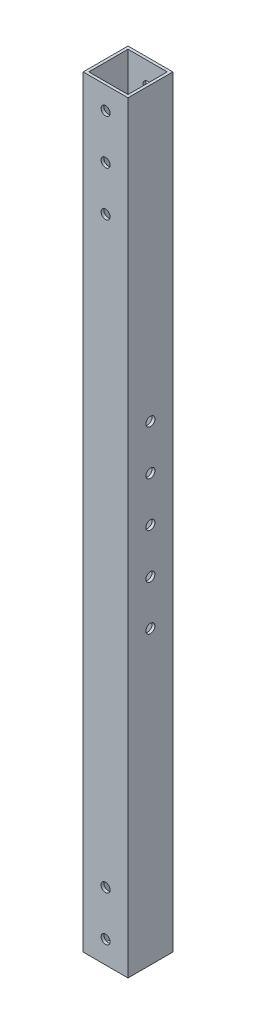
ISO-10303-21;
HEADER;
FILE_DESCRIPTION(('STEP AP214'),'2;1');
FILE_NAME('part.step','',(''),(''),'','','');
FILE_SCHEMA(('AUTOMOTIVE_DESIGN { 1 0 10303 214 1 1 1 1 }'));
ENDSEC;
DATA;
#1=APPLICATION_CONTEXT('core data for automotive mechanical design processes');
#2=APPLICATION_PROTOCOL_DEFINITION('international standard','automotive_design',2000,#1);
#3=PRODUCT_CONTEXT('',#1,'mechanical');
#4=PRODUCT('Part','Part','',(#3));
#5=PRODUCT_RELATED_PRODUCT_CATEGORY('part','',(#4));
#6=PRODUCT_DEFINITION_FORMATION('','',#4);
#7=PRODUCT_DEFINITION_CONTEXT('part definition',#1,'design');
#8=PRODUCT_DEFINITION('design','',#6,#7);
#9=PRODUCT_DEFINITION_SHAPE('','',#8);
#10=(LENGTH_UNIT() NAMED_UNIT(*) SI_UNIT(.MILLI.,.METRE.));
#11=(NAMED_UNIT(*) PLANE_ANGLE_UNIT() SI_UNIT($,.RADIAN.));
#12=(NAMED_UNIT(*) SI_UNIT($,.STERADIAN.) SOLID_ANGLE_UNIT());
#13=UNCERTAINTY_MEASURE_WITH_UNIT(LENGTH_MEASURE(1.E-05),#10,'distance_accuracy_value','');
#14=(GEOMETRIC_REPRESENTATION_CONTEXT(3) GLOBAL_UNCERTAINTY_ASSIGNED_CONTEXT((#13)) GLOBAL_UNIT_ASSIGNED_CONTEXT((#10,
#11,#12)) REPRESENTATION_CONTEXT('',''));
#15=CARTESIAN_POINT('',(0.,0.,0.));
#16=DIRECTION('',(0.,0.,1.));
#17=DIRECTION('',(1.,0.,0.));
#18=AXIS2_PLACEMENT_3D('',#15,#16,#17);
#19=CARTESIAN_POINT('',(0.,431.8,0.));
#20=DIRECTION('',(0.,-1.,0.));
#21=DIRECTION('',(0.,0.,-1.));
#22=AXIS2_PLACEMENT_3D('',#19,#20,#21);
#23=PLANE('',#22);
#24=DIRECTION('',(0.,0.,-1.));
#25=VECTOR('',#24,1.);
#26=CARTESIAN_POINT('',(12.7,431.8,12.7));
#27=LINE('',#26,#25);
#28=CARTESIAN_POINT('',(12.7,431.8,12.7));
#29=VERTEX_POINT('',#28);
#30=CARTESIAN_POINT('',(12.7,431.8,-12.7));
#31=VERTEX_POINT('',#30);
#32=EDGE_CURVE('E142',#29,#31,#27,.T.);
#33=ORIENTED_EDGE('',*,*,#32,.T.);
#34=DIRECTION('',(-1.,0.,0.));
#35=VECTOR('',#34,1.);
#36=CARTESIAN_POINT('',(-12.7,431.8,-12.7));
#37=LINE('',#36,#35);
#38=CARTESIAN_POINT('',(-12.7,431.8,-12.7));
#39=VERTEX_POINT('',#38);
#40=EDGE_CURVE('E145',#31,#39,#37,.T.);
#41=ORIENTED_EDGE('',*,*,#40,.T.);
#42=DIRECTION('',(0.,0.,1.));
#43=VECTOR('',#42,1.);
#44=CARTESIAN_POINT('',(-12.7,431.8,12.7));
#45=LINE('',#44,#43);
#46=CARTESIAN_POINT('',(-12.7,431.8,12.7));
#47=VERTEX_POINT('',#46);
#48=EDGE_CURVE('E148',#39,#47,#45,.T.);
#49=ORIENTED_EDGE('',*,*,#48,.T.);
#50=DIRECTION('',(1.,0.,0.));
#51=VECTOR('',#50,1.);
#52=CARTESIAN_POINT('',(-12.7,431.8,12.7));
#53=LINE('',#52,#51);
#54=EDGE_CURVE('E150',#47,#29,#53,.T.);
#55=ORIENTED_EDGE('',*,*,#54,.T.);
#56=EDGE_LOOP('',(#33,#41,#49,#55));
#57=FACE_BOUND('',#56,.T.);
#58=DIRECTION('',(0.,0.,-1.));
#59=VECTOR('',#58,1.);
#60=CARTESIAN_POINT('',(11.1125,431.8,11.1125));
#61=LINE('',#60,#59);
#62=CARTESIAN_POINT('',(11.1125,431.8,11.1125));
#63=VERTEX_POINT('',#62);
#64=CARTESIAN_POINT('',(11.1125,431.8,-11.1125));
#65=VERTEX_POINT('',#64);
#66=EDGE_CURVE('E104',#63,#65,#61,.T.);
#67=ORIENTED_EDGE('',*,*,#66,.F.);
#68=DIRECTION('',(1.,0.,0.));
#69=VECTOR('',#68,1.);
#70=CARTESIAN_POINT('',(-11.1125,431.8,11.1125));
#71=LINE('',#70,#69);
#72=CARTESIAN_POINT('',(-11.1125,431.8,11.1125));
#73=VERTEX_POINT('',#72);
#74=EDGE_CURVE('E126',#73,#63,#71,.T.);
#75=ORIENTED_EDGE('',*,*,#74,.F.);
#76=DIRECTION('',(0.,0.,1.));
#77=VECTOR('',#76,1.);
#78=CARTESIAN_POINT('',(-11.1125,431.8,11.1125));
#79=LINE('',#78,#77);
#80=CARTESIAN_POINT('',(-11.1125,431.8,-11.1125));
#81=VERTEX_POINT('',#80);
#82=EDGE_CURVE('E124',#81,#73,#79,.T.);
#83=ORIENTED_EDGE('',*,*,#82,.F.);
#84=DIRECTION('',(-1.,0.,0.));
#85=VECTOR('',#84,1.);
#86=CARTESIAN_POINT('',(-11.1125,431.8,-11.1125));
#87=LINE('',#86,#85);
#88=EDGE_CURVE('E112',#65,#81,#87,.T.);
#89=ORIENTED_EDGE('',*,*,#88,.F.);
#90=EDGE_LOOP('',(#67,#75,#83,#89));
#91=FACE_BOUND('',#90,.T.);
#92=ADVANCED_FACE('F37',(#57,#91),#23,.F.);
#93=CARTESIAN_POINT('',(0.,0.,0.));
#94=DIRECTION('',(0.,-1.,0.));
#95=DIRECTION('',(0.,0.,-1.));
#96=AXIS2_PLACEMENT_3D('',#93,#94,#95);
#97=PLANE('',#96);
#98=DIRECTION('',(0.,0.,-1.));
#99=VECTOR('',#98,1.);
#100=CARTESIAN_POINT('',(12.7,0.,12.7));
#101=LINE('',#100,#99);
#102=CARTESIAN_POINT('',(12.7,0.,12.7));
#103=VERTEX_POINT('',#102);
#104=CARTESIAN_POINT('',(12.7,0.,-12.7));
#105=VERTEX_POINT('',#104);
#106=EDGE_CURVE('E120',#103,#105,#101,.T.);
#107=ORIENTED_EDGE('',*,*,#106,.F.);
#108=DIRECTION('',(1.,0.,0.));
#109=VECTOR('',#108,1.);
#110=CARTESIAN_POINT('',(-12.7,0.,12.7));
#111=LINE('',#110,#109);
#112=CARTESIAN_POINT('',(-12.7,0.,12.7));
#113=VERTEX_POINT('',#112);
#114=EDGE_CURVE('E146',#113,#103,#111,.T.);
#115=ORIENTED_EDGE('',*,*,#114,.F.);
#116=DIRECTION('',(0.,0.,1.));
#117=VECTOR('',#116,1.);
#118=CARTESIAN_POINT('',(-12.7,0.,12.7));
#119=LINE('',#118,#117);
#120=CARTESIAN_POINT('',(-12.7,0.,-12.7));
#121=VERTEX_POINT('',#120);
#122=EDGE_CURVE('E157',#121,#113,#119,.T.);
#123=ORIENTED_EDGE('',*,*,#122,.F.);
#124=DIRECTION('',(-1.,0.,0.));
#125=VECTOR('',#124,1.);
#126=CARTESIAN_POINT('',(-12.7,0.,-12.7));
#127=LINE('',#126,#125);
#128=EDGE_CURVE('E155',#105,#121,#127,.T.);
#129=ORIENTED_EDGE('',*,*,#128,.F.);
#130=EDGE_LOOP('',(#107,#115,#123,#129));
#131=FACE_BOUND('',#130,.T.);
#132=DIRECTION('',(1.,0.,0.));
#133=VECTOR('',#132,1.);
#134=CARTESIAN_POINT('',(-11.1125,0.,11.1125));
#135=LINE('',#134,#133);
#136=CARTESIAN_POINT('',(-11.1125,0.,11.1125));
#137=VERTEX_POINT('',#136);
#138=CARTESIAN_POINT('',(11.1125,0.,11.1125));
#139=VERTEX_POINT('',#138);
#140=EDGE_CURVE('E113',#137,#139,#135,.T.);
#141=ORIENTED_EDGE('',*,*,#140,.T.);
#142=DIRECTION('',(0.,0.,-1.));
#143=VECTOR('',#142,1.);
#144=CARTESIAN_POINT('',(11.1125,0.,11.1125));
#145=LINE('',#144,#143);
#146=CARTESIAN_POINT('',(11.1125,0.,-11.1125));
#147=VERTEX_POINT('',#146);
#148=EDGE_CURVE('E62',#139,#147,#145,.T.);
#149=ORIENTED_EDGE('',*,*,#148,.T.);
#150=DIRECTION('',(-1.,0.,0.));
#151=VECTOR('',#150,1.);
#152=CARTESIAN_POINT('',(-11.1125,0.,-11.1125));
#153=LINE('',#152,#151);
#154=CARTESIAN_POINT('',(-11.1125,0.,-11.1125));
#155=VERTEX_POINT('',#154);
#156=EDGE_CURVE('E119',#147,#155,#153,.T.);
#157=ORIENTED_EDGE('',*,*,#156,.T.);
#158=DIRECTION('',(0.,0.,1.));
#159=VECTOR('',#158,1.);
#160=CARTESIAN_POINT('',(-11.1125,0.,11.1125));
#161=LINE('',#160,#159);
#162=EDGE_CURVE('E134',#155,#137,#161,.T.);
#163=ORIENTED_EDGE('',*,*,#162,.T.);
#164=EDGE_LOOP('',(#141,#149,#157,#163));
#165=FACE_BOUND('',#164,.T.);
#166=ADVANCED_FACE('F301',(#131,#165),#97,.T.);
#167=CARTESIAN_POINT('',(12.7,431.8,12.7));
#168=DIRECTION('',(-1.,0.,0.));
#169=DIRECTION('',(0.,0.,1.));
#170=AXIS2_PLACEMENT_3D('',#167,#168,#169);
#171=PLANE('',#170);
#172=CARTESIAN_POINT('',(12.7,165.1,5.22769947430191E-13));
#173=DIRECTION('',(1.,0.,0.));
#174=DIRECTION('',(0.,0.,-1.));
#175=AXIS2_PLACEMENT_3D('',#172,#173,#174);
#176=CIRCLE('',#175,2.55269999999999);
#177=CARTESIAN_POINT('',(12.7,165.1,-2.55269999999947));
#178=VERTEX_POINT('',#177);
#179=EDGE_CURVE('E413',#178,#178,#176,.T.);
#180=ORIENTED_EDGE('',*,*,#179,.F.);
#181=EDGE_LOOP('',(#180));
#182=FACE_BOUND('',#181,.T.);
#183=CARTESIAN_POINT('',(12.7,190.5,6.09898272001889E-13));
#184=DIRECTION('',(1.,0.,0.));
#185=DIRECTION('',(0.,0.,-1.));
#186=AXIS2_PLACEMENT_3D('',#183,#184,#185);
#187=CIRCLE('',#186,2.55269999999999);
#188=CARTESIAN_POINT('',(12.7,190.5,-2.55269999999938));
#189=VERTEX_POINT('',#188);
#190=EDGE_CURVE('E191',#189,#189,#187,.T.);
#191=ORIENTED_EDGE('',*,*,#190,.F.);
#192=EDGE_LOOP('',(#191));
#193=FACE_BOUND('',#192,.T.);
#194=CARTESIAN_POINT('',(12.7,215.9,6.97026596573588E-13));
#195=DIRECTION('',(1.,0.,0.));
#196=DIRECTION('',(0.,0.,-1.));
#197=AXIS2_PLACEMENT_3D('',#194,#195,#196);
#198=CIRCLE('',#197,2.55269999999999);
#199=CARTESIAN_POINT('',(12.7,215.9,-2.55269999999929));
#200=VERTEX_POINT('',#199);
#201=EDGE_CURVE('E188',#200,#200,#198,.T.);
#202=ORIENTED_EDGE('',*,*,#201,.F.);
#203=EDGE_LOOP('',(#202));
#204=FACE_BOUND('',#203,.T.);
#205=CARTESIAN_POINT('',(12.7,241.3,7.84154921145286E-13));
#206=DIRECTION('',(1.,0.,0.));
#207=DIRECTION('',(0.,0.,-1.));
#208=AXIS2_PLACEMENT_3D('',#205,#206,#207);
#209=CIRCLE('',#208,2.55269999999999);
#210=CARTESIAN_POINT('',(12.7,241.3,-2.55269999999921));
#211=VERTEX_POINT('',#210);
#212=EDGE_CURVE('E206',#211,#211,#209,.T.);
#213=ORIENTED_EDGE('',*,*,#212,.F.);
#214=EDGE_LOOP('',(#213));
#215=FACE_BOUND('',#214,.T.);
#216=CARTESIAN_POINT('',(12.7,266.7,8.71283245716985E-13));
#217=DIRECTION('',(1.,0.,0.));
#218=DIRECTION('',(0.,0.,-1.));
#219=AXIS2_PLACEMENT_3D('',#216,#217,#218);
#220=CIRCLE('',#219,2.55269999999996);
#221=CARTESIAN_POINT('',(12.7,266.7,-2.55269999999909));
#222=VERTEX_POINT('',#221);
#223=EDGE_CURVE('E218',#222,#222,#220,.T.);
#224=ORIENTED_EDGE('',*,*,#223,.F.);
#225=EDGE_LOOP('',(#224));
#226=FACE_BOUND('',#225,.T.);
#227=ORIENTED_EDGE('',*,*,#106,.T.);
#228=DIRECTION('',(0.,-1.,0.));
#229=VECTOR('',#228,1.);
#230=CARTESIAN_POINT('',(12.7,431.8,-12.7));
#231=LINE('',#230,#229);
#232=EDGE_CURVE('E11',#31,#105,#231,.T.);
#233=ORIENTED_EDGE('',*,*,#232,.F.);
#234=ORIENTED_EDGE('',*,*,#32,.F.);
#235=DIRECTION('',(0.,-1.,0.));
#236=VECTOR('',#235,1.);
#237=CARTESIAN_POINT('',(12.7,431.8,12.7));
#238=LINE('',#237,#236);
#239=EDGE_CURVE('E152',#29,#103,#238,.T.);
#240=ORIENTED_EDGE('',*,*,#239,.T.);
#241=EDGE_LOOP('',(#227,#233,#234,#240));
#242=FACE_BOUND('',#241,.T.);
#243=ADVANCED_FACE('F39',(#182,#193,#204,#215,#226,#242),#171,.F.);
#244=CARTESIAN_POINT('',(-12.7,431.8,-12.7));
#245=DIRECTION('',(0.,0.,1.));
#246=DIRECTION('',(1.,0.,0.));
#247=AXIS2_PLACEMENT_3D('',#244,#245,#246);
#248=PLANE('',#247);
#249=CARTESIAN_POINT('',(0.,12.7,-12.7));
#250=DIRECTION('',(0.,0.,1.));
#251=DIRECTION('',(1.,0.,0.));
#252=AXIS2_PLACEMENT_3D('',#249,#250,#251);
#253=CIRCLE('',#252,2.5527);
#254=CARTESIAN_POINT('',(2.5527,12.7,-12.7));
#255=VERTEX_POINT('',#254);
#256=EDGE_CURVE('E233',#255,#255,#253,.T.);
#257=ORIENTED_EDGE('',*,*,#256,.T.);
#258=EDGE_LOOP('',(#257));
#259=FACE_BOUND('',#258,.T.);
#260=CARTESIAN_POINT('',(0.,38.1,-12.7));
#261=DIRECTION('',(0.,0.,1.));
#262=DIRECTION('',(1.,0.,0.));
#263=AXIS2_PLACEMENT_3D('',#260,#261,#262);
#264=CIRCLE('',#263,2.5527);
#265=CARTESIAN_POINT('',(2.55269999999991,38.1,-12.7));
#266=VERTEX_POINT('',#265);
#267=EDGE_CURVE('E245',#266,#266,#264,.T.);
#268=ORIENTED_EDGE('',*,*,#267,.T.);
#269=EDGE_LOOP('',(#268));
#270=FACE_BOUND('',#269,.T.);
#271=CARTESIAN_POINT('',(-1.21979654400378E-12,368.3,-12.7));
#272=DIRECTION('',(0.,0.,1.));
#273=DIRECTION('',(1.,0.,0.));
#274=AXIS2_PLACEMENT_3D('',#271,#272,#273);
#275=CIRCLE('',#274,2.5527);
#276=CARTESIAN_POINT('',(2.55269999999878,368.3,-12.7));
#277=VERTEX_POINT('',#276);
#278=EDGE_CURVE('E176',#277,#277,#275,.T.);
#279=ORIENTED_EDGE('',*,*,#278,.T.);
#280=EDGE_LOOP('',(#279));
#281=FACE_BOUND('',#280,.T.);
#282=CARTESIAN_POINT('',(-1.30692486857548E-12,393.7,-12.7));
#283=DIRECTION('',(0.,0.,1.));
#284=DIRECTION('',(1.,0.,0.));
#285=AXIS2_PLACEMENT_3D('',#282,#283,#284);
#286=CIRCLE('',#285,2.5527);
#287=CARTESIAN_POINT('',(2.55269999999869,393.7,-12.7));
#288=VERTEX_POINT('',#287);
#289=EDGE_CURVE('E171',#288,#288,#286,.T.);
#290=ORIENTED_EDGE('',*,*,#289,.T.);
#291=EDGE_LOOP('',(#290));
#292=FACE_BOUND('',#291,.T.);
#293=CARTESIAN_POINT('',(-1.39405319314718E-12,419.1,-12.7));
#294=DIRECTION('',(0.,0.,1.));
#295=DIRECTION('',(1.,0.,0.));
#296=AXIS2_PLACEMENT_3D('',#293,#294,#295);
#297=CIRCLE('',#296,2.5527);
#298=CARTESIAN_POINT('',(2.5526999999986,419.1,-12.7));
#299=VERTEX_POINT('',#298);
#300=EDGE_CURVE('E271',#299,#299,#297,.T.);
#301=ORIENTED_EDGE('',*,*,#300,.T.);
#302=EDGE_LOOP('',(#301));
#303=FACE_BOUND('',#302,.T.);
#304=ORIENTED_EDGE('',*,*,#128,.T.);
#305=DIRECTION('',(0.,-1.,0.));
#306=VECTOR('',#305,1.);
#307=CARTESIAN_POINT('',(-12.7,431.8,-12.7));
#308=LINE('',#307,#306);
#309=EDGE_CURVE('E46',#39,#121,#308,.T.);
#310=ORIENTED_EDGE('',*,*,#309,.F.);
#311=ORIENTED_EDGE('',*,*,#40,.F.);
#312=ORIENTED_EDGE('',*,*,#232,.T.);
#313=EDGE_LOOP('',(#304,#310,#311,#312));
#314=FACE_BOUND('',#313,.T.);
#315=ADVANCED_FACE('F314',(#259,#270,#281,#292,#303,#314),#248,.F.);
#316=CARTESIAN_POINT('',(-12.7,431.8,12.7));
#317=DIRECTION('',(1.,0.,0.));
#318=DIRECTION('',(0.,0.,-1.));
#319=AXIS2_PLACEMENT_3D('',#316,#317,#318);
#320=PLANE('',#319);
#321=CARTESIAN_POINT('',(-12.7,165.1,5.22769947430191E-13));
#322=DIRECTION('',(1.,0.,0.));
#323=DIRECTION('',(0.,0.,-1.));
#324=AXIS2_PLACEMENT_3D('',#321,#322,#323);
#325=CIRCLE('',#324,2.55269999999999);
#326=CARTESIAN_POINT('',(-12.7,165.1,-2.55269999999947));
#327=VERTEX_POINT('',#326);
#328=EDGE_CURVE('E412',#327,#327,#325,.T.);
#329=ORIENTED_EDGE('',*,*,#328,.T.);
#330=EDGE_LOOP('',(#329));
#331=FACE_BOUND('',#330,.T.);
#332=CARTESIAN_POINT('',(-12.7,190.5,6.09898272001889E-13));
#333=DIRECTION('',(1.,0.,0.));
#334=DIRECTION('',(0.,0.,-1.));
#335=AXIS2_PLACEMENT_3D('',#332,#333,#334);
#336=CIRCLE('',#335,2.55269999999999);
#337=CARTESIAN_POINT('',(-12.7,190.5,-2.55269999999938));
#338=VERTEX_POINT('',#337);
#339=EDGE_CURVE('E184',#338,#338,#336,.T.);
#340=ORIENTED_EDGE('',*,*,#339,.T.);
#341=EDGE_LOOP('',(#340));
#342=FACE_BOUND('',#341,.T.);
#343=CARTESIAN_POINT('',(-12.7,215.9,6.97026596573588E-13));
#344=DIRECTION('',(1.,0.,0.));
#345=DIRECTION('',(0.,0.,-1.));
#346=AXIS2_PLACEMENT_3D('',#343,#344,#345);
#347=CIRCLE('',#346,2.55269999999999);
#348=CARTESIAN_POINT('',(-12.7,215.9,-2.55269999999929));
#349=VERTEX_POINT('',#348);
#350=EDGE_CURVE('E180',#349,#349,#347,.T.);
#351=ORIENTED_EDGE('',*,*,#350,.T.);
#352=EDGE_LOOP('',(#351));
#353=FACE_BOUND('',#352,.T.);
#354=CARTESIAN_POINT('',(-12.7,241.3,7.84154921145286E-13));
#355=DIRECTION('',(1.,0.,0.));
#356=DIRECTION('',(0.,0.,-1.));
#357=AXIS2_PLACEMENT_3D('',#354,#355,#356);
#358=CIRCLE('',#357,2.55269999999999);
#359=CARTESIAN_POINT('',(-12.7,241.3,-2.55269999999921));
#360=VERTEX_POINT('',#359);
#361=EDGE_CURVE('E209',#360,#360,#358,.T.);
#362=ORIENTED_EDGE('',*,*,#361,.T.);
#363=EDGE_LOOP('',(#362));
#364=FACE_BOUND('',#363,.T.);
#365=CARTESIAN_POINT('',(-12.7,266.7,8.71283245716985E-13));
#366=DIRECTION('',(1.,0.,0.));
#367=DIRECTION('',(0.,0.,-1.));
#368=AXIS2_PLACEMENT_3D('',#365,#366,#367);
#369=CIRCLE('',#368,2.55270000000002);
#370=CARTESIAN_POINT('',(-12.7,266.7,-2.55269999999915));
#371=VERTEX_POINT('',#370);
#372=EDGE_CURVE('E221',#371,#371,#369,.T.);
#373=ORIENTED_EDGE('',*,*,#372,.T.);
#374=EDGE_LOOP('',(#373));
#375=FACE_BOUND('',#374,.T.);
#376=ORIENTED_EDGE('',*,*,#122,.T.);
#377=DIRECTION('',(0.,-1.,0.));
#378=VECTOR('',#377,1.);
#379=CARTESIAN_POINT('',(-12.7,431.8,12.7));
#380=LINE('',#379,#378);
#381=EDGE_CURVE('E162',#47,#113,#380,.T.);
#382=ORIENTED_EDGE('',*,*,#381,.F.);
#383=ORIENTED_EDGE('',*,*,#48,.F.);
#384=ORIENTED_EDGE('',*,*,#309,.T.);
#385=EDGE_LOOP('',(#376,#382,#383,#384));
#386=FACE_BOUND('',#385,.T.);
#387=ADVANCED_FACE('F311',(#331,#342,#353,#364,#375,#386),#320,.F.);
#388=CARTESIAN_POINT('',(-12.7,431.8,12.7));
#389=DIRECTION('',(0.,0.,-1.));
#390=DIRECTION('',(-1.,0.,0.));
#391=AXIS2_PLACEMENT_3D('',#388,#389,#390);
#392=PLANE('',#391);
#393=CARTESIAN_POINT('',(0.,12.7,12.7));
#394=DIRECTION('',(0.,0.,1.));
#395=DIRECTION('',(1.,0.,0.));
#396=AXIS2_PLACEMENT_3D('',#393,#394,#395);
#397=CIRCLE('',#396,2.55269999999999);
#398=CARTESIAN_POINT('',(2.55269999999999,12.7,12.7));
#399=VERTEX_POINT('',#398);
#400=EDGE_CURVE('E230',#399,#399,#397,.T.);
#401=ORIENTED_EDGE('',*,*,#400,.F.);
#402=EDGE_LOOP('',(#401));
#403=FACE_BOUND('',#402,.T.);
#404=CARTESIAN_POINT('',(0.,38.1,12.7));
#405=DIRECTION('',(0.,0.,1.));
#406=DIRECTION('',(1.,0.,0.));
#407=AXIS2_PLACEMENT_3D('',#404,#405,#406);
#408=CIRCLE('',#407,2.55269999999999);
#409=CARTESIAN_POINT('',(2.5526999999999,38.1,12.7));
#410=VERTEX_POINT('',#409);
#411=EDGE_CURVE('E242',#410,#410,#408,.T.);
#412=ORIENTED_EDGE('',*,*,#411,.F.);
#413=EDGE_LOOP('',(#412));
#414=FACE_BOUND('',#413,.T.);
#415=CARTESIAN_POINT('',(-1.21979654400378E-12,368.3,12.7));
#416=DIRECTION('',(0.,0.,1.));
#417=DIRECTION('',(1.,0.,0.));
#418=AXIS2_PLACEMENT_3D('',#415,#416,#417);
#419=CIRCLE('',#418,2.55269999999999);
#420=CARTESIAN_POINT('',(2.55269999999877,368.3,12.7));
#421=VERTEX_POINT('',#420);
#422=EDGE_CURVE('E254',#421,#421,#419,.T.);
#423=ORIENTED_EDGE('',*,*,#422,.F.);
#424=EDGE_LOOP('',(#423));
#425=FACE_BOUND('',#424,.T.);
#426=CARTESIAN_POINT('',(-1.30692486857548E-12,393.7,12.7));
#427=DIRECTION('',(0.,0.,1.));
#428=DIRECTION('',(1.,0.,0.));
#429=AXIS2_PLACEMENT_3D('',#426,#427,#428);
#430=CIRCLE('',#429,2.55269999999999);
#431=CARTESIAN_POINT('',(2.55269999999868,393.7,12.7));
#432=VERTEX_POINT('',#431);
#433=EDGE_CURVE('E261',#432,#432,#430,.T.);
#434=ORIENTED_EDGE('',*,*,#433,.F.);
#435=EDGE_LOOP('',(#434));
#436=FACE_BOUND('',#435,.T.);
#437=CARTESIAN_POINT('',(-1.39405319314718E-12,419.1,12.7));
#438=DIRECTION('',(0.,0.,1.));
#439=DIRECTION('',(1.,0.,0.));
#440=AXIS2_PLACEMENT_3D('',#437,#438,#439);
#441=CIRCLE('',#440,2.55269999999999);
#442=CARTESIAN_POINT('',(2.55269999999859,419.1,12.7));
#443=VERTEX_POINT('',#442);
#444=EDGE_CURVE('E268',#443,#443,#441,.T.);
#445=ORIENTED_EDGE('',*,*,#444,.F.);
#446=EDGE_LOOP('',(#445));
#447=FACE_BOUND('',#446,.T.);
#448=ORIENTED_EDGE('',*,*,#114,.T.);
#449=ORIENTED_EDGE('',*,*,#239,.F.);
#450=ORIENTED_EDGE('',*,*,#54,.F.);
#451=ORIENTED_EDGE('',*,*,#381,.T.);
#452=EDGE_LOOP('',(#448,#449,#450,#451));
#453=FACE_BOUND('',#452,.T.);
#454=ADVANCED_FACE('F295',(#403,#414,#425,#436,#447,#453),#392,.F.);
#455=CARTESIAN_POINT('',(11.1125,431.8,11.1125));
#456=DIRECTION('',(-1.,0.,0.));
#457=DIRECTION('',(0.,0.,1.));
#458=AXIS2_PLACEMENT_3D('',#455,#456,#457);
#459=PLANE('',#458);
#460=CARTESIAN_POINT('',(11.1125,165.1,5.22769947430191E-13));
#461=DIRECTION('',(-1.,0.,0.));
#462=DIRECTION('',(0.,0.,1.));
#463=AXIS2_PLACEMENT_3D('',#460,#461,#462);
#464=CIRCLE('',#463,2.55269999999999);
#465=CARTESIAN_POINT('',(11.1125,165.1,2.55270000000051));
#466=VERTEX_POINT('',#465);
#467=EDGE_CURVE('E196',#466,#466,#464,.T.);
#468=ORIENTED_EDGE('',*,*,#467,.F.);
#469=EDGE_LOOP('',(#468));
#470=FACE_BOUND('',#469,.T.);
#471=CARTESIAN_POINT('',(11.1125,190.5,6.09898272001889E-13));
#472=DIRECTION('',(-1.,0.,0.));
#473=DIRECTION('',(0.,0.,1.));
#474=AXIS2_PLACEMENT_3D('',#471,#472,#473);
#475=CIRCLE('',#474,2.55269999999999);
#476=CARTESIAN_POINT('',(11.1125,190.5,2.5527000000006));
#477=VERTEX_POINT('',#476);
#478=EDGE_CURVE('E183',#477,#477,#475,.T.);
#479=ORIENTED_EDGE('',*,*,#478,.F.);
#480=EDGE_LOOP('',(#479));
#481=FACE_BOUND('',#480,.T.);
#482=CARTESIAN_POINT('',(11.1125,215.9,6.97026596573588E-13));
#483=DIRECTION('',(-1.,0.,0.));
#484=DIRECTION('',(0.,0.,1.));
#485=AXIS2_PLACEMENT_3D('',#482,#483,#484);
#486=CIRCLE('',#485,2.55269999999999);
#487=CARTESIAN_POINT('',(11.1125,215.9,2.55270000000069));
#488=VERTEX_POINT('',#487);
#489=EDGE_CURVE('E179',#488,#488,#486,.T.);
#490=ORIENTED_EDGE('',*,*,#489,.F.);
#491=EDGE_LOOP('',(#490));
#492=FACE_BOUND('',#491,.T.);
#493=CARTESIAN_POINT('',(11.1125,241.3,7.84154921145286E-13));
#494=DIRECTION('',(-1.,0.,0.));
#495=DIRECTION('',(0.,0.,1.));
#496=AXIS2_PLACEMENT_3D('',#493,#494,#495);
#497=CIRCLE('',#496,2.55269999999999);
#498=CARTESIAN_POINT('',(11.1125,241.3,2.55270000000078));
#499=VERTEX_POINT('',#498);
#500=EDGE_CURVE('E215',#499,#499,#497,.T.);
#501=ORIENTED_EDGE('',*,*,#500,.F.);
#502=EDGE_LOOP('',(#501));
#503=FACE_BOUND('',#502,.T.);
#504=CARTESIAN_POINT('',(11.1125,266.7,8.71283245716985E-13));
#505=DIRECTION('',(-1.,0.,0.));
#506=DIRECTION('',(0.,0.,1.));
#507=AXIS2_PLACEMENT_3D('',#504,#505,#506);
#508=CIRCLE('',#507,2.55269999999999);
#509=CARTESIAN_POINT('',(11.1125,266.7,2.55270000000086));
#510=VERTEX_POINT('',#509);
#511=EDGE_CURVE('E227',#510,#510,#508,.T.);
#512=ORIENTED_EDGE('',*,*,#511,.F.);
#513=EDGE_LOOP('',(#512));
#514=FACE_BOUND('',#513,.T.);
#515=ORIENTED_EDGE('',*,*,#148,.F.);
#516=DIRECTION('',(0.,-1.,0.));
#517=VECTOR('',#516,1.);
#518=CARTESIAN_POINT('',(11.1125,431.8,11.1125));
#519=LINE('',#518,#517);
#520=EDGE_CURVE('E108',#63,#139,#519,.T.);
#521=ORIENTED_EDGE('',*,*,#520,.F.);
#522=ORIENTED_EDGE('',*,*,#66,.T.);
#523=DIRECTION('',(0.,-1.,0.));
#524=VECTOR('',#523,1.);
#525=CARTESIAN_POINT('',(11.1125,431.8,-11.1125));
#526=LINE('',#525,#524);
#527=EDGE_CURVE('E107',#65,#147,#526,.T.);
#528=ORIENTED_EDGE('',*,*,#527,.T.);
#529=EDGE_LOOP('',(#515,#521,#522,#528));
#530=FACE_BOUND('',#529,.T.);
#531=ADVANCED_FACE('F106',(#470,#481,#492,#503,#514,#530),#459,.T.);
#532=CARTESIAN_POINT('',(-11.1125,431.8,-11.1125));
#533=DIRECTION('',(0.,0.,1.));
#534=DIRECTION('',(1.,0.,0.));
#535=AXIS2_PLACEMENT_3D('',#532,#533,#534);
#536=PLANE('',#535);
#537=CARTESIAN_POINT('',(0.,12.7,-11.1125));
#538=DIRECTION('',(0.,0.,1.));
#539=DIRECTION('',(1.,0.,0.));
#540=AXIS2_PLACEMENT_3D('',#537,#538,#539);
#541=CIRCLE('',#540,2.55269999999999);
#542=CARTESIAN_POINT('',(2.55269999999999,12.7,-11.1125));
#543=VERTEX_POINT('',#542);
#544=EDGE_CURVE('E236',#543,#543,#541,.T.);
#545=ORIENTED_EDGE('',*,*,#544,.F.);
#546=EDGE_LOOP('',(#545));
#547=FACE_BOUND('',#546,.T.);
#548=CARTESIAN_POINT('',(0.,38.1,-11.1125));
#549=DIRECTION('',(0.,0.,1.));
#550=DIRECTION('',(1.,0.,0.));
#551=AXIS2_PLACEMENT_3D('',#548,#549,#550);
#552=CIRCLE('',#551,2.55269999999999);
#553=CARTESIAN_POINT('',(2.5526999999999,38.1,-11.1125));
#554=VERTEX_POINT('',#553);
#555=EDGE_CURVE('E251',#554,#554,#552,.T.);
#556=ORIENTED_EDGE('',*,*,#555,.F.);
#557=EDGE_LOOP('',(#556));
#558=FACE_BOUND('',#557,.T.);
#559=CARTESIAN_POINT('',(-1.21979654400378E-12,368.3,-11.1125));
#560=DIRECTION('',(0.,0.,1.));
#561=DIRECTION('',(1.,0.,0.));
#562=AXIS2_PLACEMENT_3D('',#559,#560,#561);
#563=CIRCLE('',#562,2.55269999999999);
#564=CARTESIAN_POINT('',(2.55269999999877,368.3,-11.1125));
#565=VERTEX_POINT('',#564);
#566=EDGE_CURVE('E175',#565,#565,#563,.T.);
#567=ORIENTED_EDGE('',*,*,#566,.F.);
#568=EDGE_LOOP('',(#567));
#569=FACE_BOUND('',#568,.T.);
#570=CARTESIAN_POINT('',(-1.30692486857548E-12,393.7,-11.1125));
#571=DIRECTION('',(0.,0.,1.));
#572=DIRECTION('',(1.,0.,0.));
#573=AXIS2_PLACEMENT_3D('',#570,#571,#572);
#574=CIRCLE('',#573,2.55269999999999);
#575=CARTESIAN_POINT('',(2.55269999999868,393.7,-11.1125));
#576=VERTEX_POINT('',#575);
#577=EDGE_CURVE('E170',#576,#576,#574,.T.);
#578=ORIENTED_EDGE('',*,*,#577,.F.);
#579=EDGE_LOOP('',(#578));
#580=FACE_BOUND('',#579,.T.);
#581=CARTESIAN_POINT('',(-1.39405319314718E-12,419.1,-11.1125));
#582=DIRECTION('',(0.,0.,1.));
#583=DIRECTION('',(1.,0.,0.));
#584=AXIS2_PLACEMENT_3D('',#581,#582,#583);
#585=CIRCLE('',#584,2.55269999999999);
#586=CARTESIAN_POINT('',(2.5526999999986,419.1,-11.1125));
#587=VERTEX_POINT('',#586);
#588=EDGE_CURVE('E132',#587,#587,#585,.T.);
#589=ORIENTED_EDGE('',*,*,#588,.F.);
#590=EDGE_LOOP('',(#589));
#591=FACE_BOUND('',#590,.T.);
#592=ORIENTED_EDGE('',*,*,#156,.F.);
#593=ORIENTED_EDGE('',*,*,#527,.F.);
#594=ORIENTED_EDGE('',*,*,#88,.T.);
#595=DIRECTION('',(0.,-1.,0.));
#596=VECTOR('',#595,1.);
#597=CARTESIAN_POINT('',(-11.1125,431.8,-11.1125));
#598=LINE('',#597,#596);
#599=EDGE_CURVE('E121',#81,#155,#598,.T.);
#600=ORIENTED_EDGE('',*,*,#599,.T.);
#601=EDGE_LOOP('',(#592,#593,#594,#600));
#602=FACE_BOUND('',#601,.T.);
#603=ADVANCED_FACE('F116',(#547,#558,#569,#580,#591,#602),#536,.T.);
#604=CARTESIAN_POINT('',(-11.1125,431.8,11.1125));
#605=DIRECTION('',(1.,0.,0.));
#606=DIRECTION('',(0.,0.,-1.));
#607=AXIS2_PLACEMENT_3D('',#604,#605,#606);
#608=PLANE('',#607);
#609=CARTESIAN_POINT('',(-11.1125,165.1,5.22769947430191E-13));
#610=DIRECTION('',(1.,0.,0.));
#611=DIRECTION('',(0.,0.,-1.));
#612=AXIS2_PLACEMENT_3D('',#609,#610,#611);
#613=CIRCLE('',#612,2.55269999999999);
#614=CARTESIAN_POINT('',(-11.1125,165.1,-2.55269999999947));
#615=VERTEX_POINT('',#614);
#616=EDGE_CURVE('E41',#615,#615,#613,.T.);
#617=ORIENTED_EDGE('',*,*,#616,.F.);
#618=EDGE_LOOP('',(#617));
#619=FACE_BOUND('',#618,.T.);
#620=CARTESIAN_POINT('',(-11.1125,190.5,6.09898272001889E-13));
#621=DIRECTION('',(1.,0.,0.));
#622=DIRECTION('',(0.,0.,-1.));
#623=AXIS2_PLACEMENT_3D('',#620,#621,#622);
#624=CIRCLE('',#623,2.55269999999999);
#625=CARTESIAN_POINT('',(-11.1125,190.5,-2.55269999999938));
#626=VERTEX_POINT('',#625);
#627=EDGE_CURVE('E181',#626,#626,#624,.T.);
#628=ORIENTED_EDGE('',*,*,#627,.F.);
#629=EDGE_LOOP('',(#628));
#630=FACE_BOUND('',#629,.T.);
#631=CARTESIAN_POINT('',(-11.1125,215.9,6.97026596573588E-13));
#632=DIRECTION('',(1.,0.,0.));
#633=DIRECTION('',(0.,0.,-1.));
#634=AXIS2_PLACEMENT_3D('',#631,#632,#633);
#635=CIRCLE('',#634,2.55269999999999);
#636=CARTESIAN_POINT('',(-11.1125,215.9,-2.55269999999929));
#637=VERTEX_POINT('',#636);
#638=EDGE_CURVE('E177',#637,#637,#635,.T.);
#639=ORIENTED_EDGE('',*,*,#638,.F.);
#640=EDGE_LOOP('',(#639));
#641=FACE_BOUND('',#640,.T.);
#642=CARTESIAN_POINT('',(-11.1125,241.3,7.84154921145286E-13));
#643=DIRECTION('',(1.,0.,0.));
#644=DIRECTION('',(0.,0.,-1.));
#645=AXIS2_PLACEMENT_3D('',#642,#643,#644);
#646=CIRCLE('',#645,2.55269999999999);
#647=CARTESIAN_POINT('',(-11.1125,241.3,-2.55269999999921));
#648=VERTEX_POINT('',#647);
#649=EDGE_CURVE('E212',#648,#648,#646,.T.);
#650=ORIENTED_EDGE('',*,*,#649,.F.);
#651=EDGE_LOOP('',(#650));
#652=FACE_BOUND('',#651,.T.);
#653=CARTESIAN_POINT('',(-11.1125,266.7,8.71283245716985E-13));
#654=DIRECTION('',(1.,0.,0.));
#655=DIRECTION('',(0.,0.,-1.));
#656=AXIS2_PLACEMENT_3D('',#653,#654,#655);
#657=CIRCLE('',#656,2.55269999999999);
#658=CARTESIAN_POINT('',(-11.1125,266.7,-2.55269999999912));
#659=VERTEX_POINT('',#658);
#660=EDGE_CURVE('E224',#659,#659,#657,.T.);
#661=ORIENTED_EDGE('',*,*,#660,.F.);
#662=EDGE_LOOP('',(#661));
#663=FACE_BOUND('',#662,.T.);
#664=ORIENTED_EDGE('',*,*,#162,.F.);
#665=ORIENTED_EDGE('',*,*,#599,.F.);
#666=ORIENTED_EDGE('',*,*,#82,.T.);
#667=DIRECTION('',(0.,-1.,0.));
#668=VECTOR('',#667,1.);
#669=CARTESIAN_POINT('',(-11.1125,431.8,11.1125));
#670=LINE('',#669,#668);
#671=EDGE_CURVE('E54',#73,#137,#670,.T.);
#672=ORIENTED_EDGE('',*,*,#671,.T.);
#673=EDGE_LOOP('',(#664,#665,#666,#672));
#674=FACE_BOUND('',#673,.T.);
#675=ADVANCED_FACE('F283',(#619,#630,#641,#652,#663,#674),#608,.T.);
#676=CARTESIAN_POINT('',(-11.1125,431.8,11.1125));
#677=DIRECTION('',(0.,0.,-1.));
#678=DIRECTION('',(-1.,0.,0.));
#679=AXIS2_PLACEMENT_3D('',#676,#677,#678);
#680=PLANE('',#679);
#681=CARTESIAN_POINT('',(0.,12.7,11.1125));
#682=DIRECTION('',(0.,0.,-1.));
#683=DIRECTION('',(-1.,0.,0.));
#684=AXIS2_PLACEMENT_3D('',#681,#682,#683);
#685=CIRCLE('',#684,2.55269999999999);
#686=CARTESIAN_POINT('',(-2.55269999999999,12.7,11.1125));
#687=VERTEX_POINT('',#686);
#688=EDGE_CURVE('E239',#687,#687,#685,.T.);
#689=ORIENTED_EDGE('',*,*,#688,.F.);
#690=EDGE_LOOP('',(#689));
#691=FACE_BOUND('',#690,.T.);
#692=CARTESIAN_POINT('',(0.,38.1,11.1125));
#693=DIRECTION('',(0.,0.,-1.));
#694=DIRECTION('',(-1.,0.,0.));
#695=AXIS2_PLACEMENT_3D('',#692,#693,#694);
#696=CIRCLE('',#695,2.55269999999999);
#697=CARTESIAN_POINT('',(-2.55270000000008,38.1,11.1125));
#698=VERTEX_POINT('',#697);
#699=EDGE_CURVE('E248',#698,#698,#696,.T.);
#700=ORIENTED_EDGE('',*,*,#699,.F.);
#701=EDGE_LOOP('',(#700));
#702=FACE_BOUND('',#701,.T.);
#703=CARTESIAN_POINT('',(-1.21979654400378E-12,368.3,11.1125));
#704=DIRECTION('',(0.,0.,-1.));
#705=DIRECTION('',(-1.,0.,0.));
#706=AXIS2_PLACEMENT_3D('',#703,#704,#705);
#707=CIRCLE('',#706,2.55269999999999);
#708=CARTESIAN_POINT('',(-2.55270000000121,368.3,11.1125));
#709=VERTEX_POINT('',#708);
#710=EDGE_CURVE('E172',#709,#709,#707,.T.);
#711=ORIENTED_EDGE('',*,*,#710,.F.);
#712=EDGE_LOOP('',(#711));
#713=FACE_BOUND('',#712,.T.);
#714=CARTESIAN_POINT('',(-1.30692486857548E-12,393.7,11.1125));
#715=DIRECTION('',(0.,0.,-1.));
#716=DIRECTION('',(-1.,0.,0.));
#717=AXIS2_PLACEMENT_3D('',#714,#715,#716);
#718=CIRCLE('',#717,2.55269999999999);
#719=CARTESIAN_POINT('',(-2.5527000000013,393.7,11.1125));
#720=VERTEX_POINT('',#719);
#721=EDGE_CURVE('E167',#720,#720,#718,.T.);
#722=ORIENTED_EDGE('',*,*,#721,.F.);
#723=EDGE_LOOP('',(#722));
#724=FACE_BOUND('',#723,.T.);
#725=CARTESIAN_POINT('',(-1.39405319314718E-12,419.1,11.1125));
#726=DIRECTION('',(0.,0.,-1.));
#727=DIRECTION('',(-1.,0.,0.));
#728=AXIS2_PLACEMENT_3D('',#725,#726,#727);
#729=CIRCLE('',#728,2.55269999999999);
#730=CARTESIAN_POINT('',(-2.55270000000139,419.1,11.1125));
#731=VERTEX_POINT('',#730);
#732=EDGE_CURVE('E274',#731,#731,#729,.T.);
#733=ORIENTED_EDGE('',*,*,#732,.F.);
#734=EDGE_LOOP('',(#733));
#735=FACE_BOUND('',#734,.T.);
#736=ORIENTED_EDGE('',*,*,#140,.F.);
#737=ORIENTED_EDGE('',*,*,#671,.F.);
#738=ORIENTED_EDGE('',*,*,#74,.T.);
#739=ORIENTED_EDGE('',*,*,#520,.T.);
#740=EDGE_LOOP('',(#736,#737,#738,#739));
#741=FACE_BOUND('',#740,.T.);
#742=ADVANCED_FACE('F291',(#691,#702,#713,#724,#735,#741),#680,.T.);
#743=CARTESIAN_POINT('',(-1.39405319314718E-12,419.1,12.7));
#744=DIRECTION('',(0.,0.,1.));
#745=DIRECTION('',(1.,0.,0.));
#746=AXIS2_PLACEMENT_3D('',#743,#744,#745);
#747=CYLINDRICAL_SURFACE('',#746,2.55269999999999);
#748=ORIENTED_EDGE('',*,*,#732,.T.);
#749=EDGE_LOOP('',(#748));
#750=FACE_BOUND('',#749,.T.);
#751=ORIENTED_EDGE('',*,*,#444,.T.);
#752=EDGE_LOOP('',(#751));
#753=FACE_BOUND('',#752,.T.);
#754=ADVANCED_FACE('F347',(#750,#753),#747,.F.);
#755=ORIENTED_EDGE('',*,*,#588,.T.);
#756=EDGE_LOOP('',(#755));
#757=FACE_BOUND('',#756,.T.);
#758=ORIENTED_EDGE('',*,*,#300,.F.);
#759=EDGE_LOOP('',(#758));
#760=FACE_BOUND('',#759,.T.);
#761=ADVANCED_FACE('F279',(#757,#760),#747,.F.);
#762=CARTESIAN_POINT('',(-1.30692486857548E-12,393.7,12.7));
#763=DIRECTION('',(0.,0.,1.));
#764=DIRECTION('',(1.,0.,0.));
#765=AXIS2_PLACEMENT_3D('',#762,#763,#764);
#766=CYLINDRICAL_SURFACE('',#765,2.55269999999999);
#767=ORIENTED_EDGE('',*,*,#721,.T.);
#768=EDGE_LOOP('',(#767));
#769=FACE_BOUND('',#768,.T.);
#770=ORIENTED_EDGE('',*,*,#433,.T.);
#771=EDGE_LOOP('',(#770));
#772=FACE_BOUND('',#771,.T.);
#773=ADVANCED_FACE('F358',(#769,#772),#766,.F.);
#774=ORIENTED_EDGE('',*,*,#577,.T.);
#775=EDGE_LOOP('',(#774));
#776=FACE_BOUND('',#775,.T.);
#777=ORIENTED_EDGE('',*,*,#289,.F.);
#778=EDGE_LOOP('',(#777));
#779=FACE_BOUND('',#778,.T.);
#780=ADVANCED_FACE('F361',(#776,#779),#766,.F.);
#781=CARTESIAN_POINT('',(-1.21979654400378E-12,368.3,12.7));
#782=DIRECTION('',(0.,0.,1.));
#783=DIRECTION('',(1.,0.,0.));
#784=AXIS2_PLACEMENT_3D('',#781,#782,#783);
#785=CYLINDRICAL_SURFACE('',#784,2.55269999999999);
#786=ORIENTED_EDGE('',*,*,#710,.T.);
#787=EDGE_LOOP('',(#786));
#788=FACE_BOUND('',#787,.T.);
#789=ORIENTED_EDGE('',*,*,#422,.T.);
#790=EDGE_LOOP('',(#789));
#791=FACE_BOUND('',#790,.T.);
#792=ADVANCED_FACE('F363',(#788,#791),#785,.F.);
#793=ORIENTED_EDGE('',*,*,#566,.T.);
#794=EDGE_LOOP('',(#793));
#795=FACE_BOUND('',#794,.T.);
#796=ORIENTED_EDGE('',*,*,#278,.F.);
#797=EDGE_LOOP('',(#796));
#798=FACE_BOUND('',#797,.T.);
#799=ADVANCED_FACE('F366',(#795,#798),#785,.F.);
#800=CARTESIAN_POINT('',(0.,38.1,12.7));
#801=DIRECTION('',(0.,0.,1.));
#802=DIRECTION('',(1.,0.,0.));
#803=AXIS2_PLACEMENT_3D('',#800,#801,#802);
#804=CYLINDRICAL_SURFACE('',#803,2.55269999999999);
#805=ORIENTED_EDGE('',*,*,#699,.T.);
#806=EDGE_LOOP('',(#805));
#807=FACE_BOUND('',#806,.T.);
#808=ORIENTED_EDGE('',*,*,#411,.T.);
#809=EDGE_LOOP('',(#808));
#810=FACE_BOUND('',#809,.T.);
#811=ADVANCED_FACE('F368',(#807,#810),#804,.F.);
#812=ORIENTED_EDGE('',*,*,#555,.T.);
#813=EDGE_LOOP('',(#812));
#814=FACE_BOUND('',#813,.T.);
#815=ORIENTED_EDGE('',*,*,#267,.F.);
#816=EDGE_LOOP('',(#815));
#817=FACE_BOUND('',#816,.T.);
#818=ADVANCED_FACE('F371',(#814,#817),#804,.F.);
#819=CARTESIAN_POINT('',(0.,12.7,12.7));
#820=DIRECTION('',(0.,0.,1.));
#821=DIRECTION('',(1.,0.,0.));
#822=AXIS2_PLACEMENT_3D('',#819,#820,#821);
#823=CYLINDRICAL_SURFACE('',#822,2.55269999999999);
#824=ORIENTED_EDGE('',*,*,#688,.T.);
#825=EDGE_LOOP('',(#824));
#826=FACE_BOUND('',#825,.T.);
#827=ORIENTED_EDGE('',*,*,#400,.T.);
#828=EDGE_LOOP('',(#827));
#829=FACE_BOUND('',#828,.T.);
#830=ADVANCED_FACE('F377',(#826,#829),#823,.F.);
#831=ORIENTED_EDGE('',*,*,#544,.T.);
#832=EDGE_LOOP('',(#831));
#833=FACE_BOUND('',#832,.T.);
#834=ORIENTED_EDGE('',*,*,#256,.F.);
#835=EDGE_LOOP('',(#834));
#836=FACE_BOUND('',#835,.T.);
#837=ADVANCED_FACE('F373',(#833,#836),#823,.F.);
#838=CARTESIAN_POINT('',(12.7,266.7,8.71283245716985E-13));
#839=DIRECTION('',(1.,0.,0.));
#840=DIRECTION('',(0.,0.,-1.));
#841=AXIS2_PLACEMENT_3D('',#838,#839,#840);
#842=CYLINDRICAL_SURFACE('',#841,2.55269999999999);
#843=ORIENTED_EDGE('',*,*,#660,.T.);
#844=EDGE_LOOP('',(#843));
#845=FACE_BOUND('',#844,.T.);
#846=ORIENTED_EDGE('',*,*,#372,.F.);
#847=EDGE_LOOP('',(#846));
#848=FACE_BOUND('',#847,.T.);
#849=ADVANCED_FACE('F376',(#845,#848),#842,.F.);
#850=ORIENTED_EDGE('',*,*,#511,.T.);
#851=EDGE_LOOP('',(#850));
#852=FACE_BOUND('',#851,.T.);
#853=ORIENTED_EDGE('',*,*,#223,.T.);
#854=EDGE_LOOP('',(#853));
#855=FACE_BOUND('',#854,.T.);
#856=ADVANCED_FACE('F381',(#852,#855),#842,.F.);
#857=CARTESIAN_POINT('',(12.7,241.3,7.84154921145286E-13));
#858=DIRECTION('',(1.,0.,0.));
#859=DIRECTION('',(0.,0.,-1.));
#860=AXIS2_PLACEMENT_3D('',#857,#858,#859);
#861=CYLINDRICAL_SURFACE('',#860,2.55269999999999);
#862=ORIENTED_EDGE('',*,*,#500,.T.);
#863=EDGE_LOOP('',(#862));
#864=FACE_BOUND('',#863,.T.);
#865=ORIENTED_EDGE('',*,*,#212,.T.);
#866=EDGE_LOOP('',(#865));
#867=FACE_BOUND('',#866,.T.);
#868=ADVANCED_FACE('F387',(#864,#867),#861,.F.);
#869=ORIENTED_EDGE('',*,*,#649,.T.);
#870=EDGE_LOOP('',(#869));
#871=FACE_BOUND('',#870,.T.);
#872=ORIENTED_EDGE('',*,*,#361,.F.);
#873=EDGE_LOOP('',(#872));
#874=FACE_BOUND('',#873,.T.);
#875=ADVANCED_FACE('F383',(#871,#874),#861,.F.);
#876=CARTESIAN_POINT('',(12.7,215.9,6.97026596573588E-13));
#877=DIRECTION('',(1.,0.,0.));
#878=DIRECTION('',(0.,0.,-1.));
#879=AXIS2_PLACEMENT_3D('',#876,#877,#878);
#880=CYLINDRICAL_SURFACE('',#879,2.55269999999999);
#881=ORIENTED_EDGE('',*,*,#638,.T.);
#882=EDGE_LOOP('',(#881));
#883=FACE_BOUND('',#882,.T.);
#884=ORIENTED_EDGE('',*,*,#350,.F.);
#885=EDGE_LOOP('',(#884));
#886=FACE_BOUND('',#885,.T.);
#887=ADVANCED_FACE('F386',(#883,#886),#880,.F.);
#888=ORIENTED_EDGE('',*,*,#489,.T.);
#889=EDGE_LOOP('',(#888));
#890=FACE_BOUND('',#889,.T.);
#891=ORIENTED_EDGE('',*,*,#201,.T.);
#892=EDGE_LOOP('',(#891));
#893=FACE_BOUND('',#892,.T.);
#894=ADVANCED_FACE('F391',(#890,#893),#880,.F.);
#895=CARTESIAN_POINT('',(12.7,190.5,6.09898272001889E-13));
#896=DIRECTION('',(1.,0.,0.));
#897=DIRECTION('',(0.,0.,-1.));
#898=AXIS2_PLACEMENT_3D('',#895,#896,#897);
#899=CYLINDRICAL_SURFACE('',#898,2.55269999999999);
#900=ORIENTED_EDGE('',*,*,#627,.T.);
#901=EDGE_LOOP('',(#900));
#902=FACE_BOUND('',#901,.T.);
#903=ORIENTED_EDGE('',*,*,#339,.F.);
#904=EDGE_LOOP('',(#903));
#905=FACE_BOUND('',#904,.T.);
#906=ADVANCED_FACE('F393',(#902,#905),#899,.F.);
#907=ORIENTED_EDGE('',*,*,#478,.T.);
#908=EDGE_LOOP('',(#907));
#909=FACE_BOUND('',#908,.T.);
#910=ORIENTED_EDGE('',*,*,#190,.T.);
#911=EDGE_LOOP('',(#910));
#912=FACE_BOUND('',#911,.T.);
#913=ADVANCED_FACE('F396',(#909,#912),#899,.F.);
#914=CARTESIAN_POINT('',(12.7,165.1,5.22769947430191E-13));
#915=DIRECTION('',(1.,0.,0.));
#916=DIRECTION('',(0.,0.,-1.));
#917=AXIS2_PLACEMENT_3D('',#914,#915,#916);
#918=CYLINDRICAL_SURFACE('',#917,2.55269999999999);
#919=ORIENTED_EDGE('',*,*,#616,.T.);
#920=EDGE_LOOP('',(#919));
#921=FACE_BOUND('',#920,.T.);
#922=ORIENTED_EDGE('',*,*,#328,.F.);
#923=EDGE_LOOP('',(#922));
#924=FACE_BOUND('',#923,.T.);
#925=ADVANCED_FACE('F397',(#921,#924),#918,.F.);
#926=ORIENTED_EDGE('',*,*,#467,.T.);
#927=EDGE_LOOP('',(#926));
#928=FACE_BOUND('',#927,.T.);
#929=ORIENTED_EDGE('',*,*,#179,.T.);
#930=EDGE_LOOP('',(#929));
#931=FACE_BOUND('',#930,.T.);
#932=ADVANCED_FACE('F399',(#928,#931),#918,.F.);
#933=CLOSED_SHELL('',(#92,#166,#243,#315,#387,#454,#531,#603,#675,#742,#754,#761,#773,#780,#792,
#799,#811,#818,#830,#837,#849,#856,#868,#875,#887,#894,#906,#913,#925,#932));
#934=MANIFOLD_SOLID_BREP('B2',#933);
#935=ADVANCED_BREP_SHAPE_REPRESENTATION('',(#18,#934),#14);
#936=SHAPE_DEFINITION_REPRESENTATION(#9,#935);
ENDSEC;
END-ISO-10303-21;
